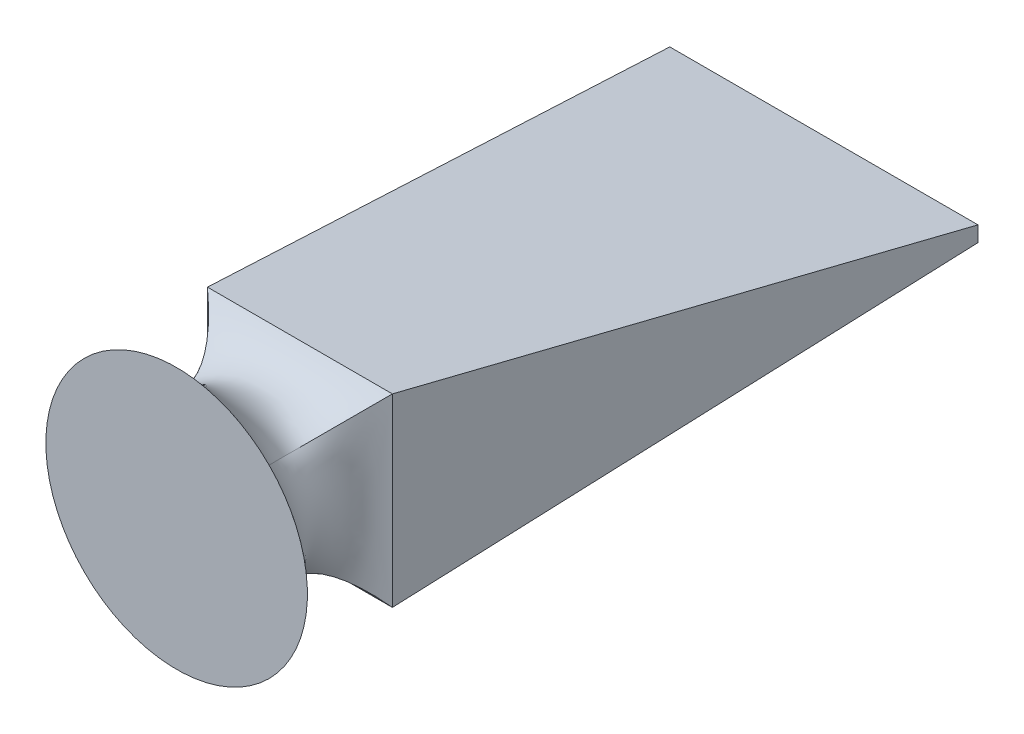
ISO-10303-21;
HEADER;
FILE_DESCRIPTION(('STEP AP214'),'2;1');
FILE_NAME('part.step','',(''),(''),'','','');
FILE_SCHEMA(('AUTOMOTIVE_DESIGN { 1 0 10303 214 1 1 1 1 }'));
ENDSEC;
DATA;
#1=APPLICATION_CONTEXT('core data for automotive mechanical design processes');
#2=APPLICATION_PROTOCOL_DEFINITION('international standard','automotive_design',2000,#1);
#3=PRODUCT_CONTEXT('',#1,'mechanical');
#4=PRODUCT('Part','Part','',(#3));
#5=PRODUCT_RELATED_PRODUCT_CATEGORY('part','',(#4));
#6=PRODUCT_DEFINITION_FORMATION('','',#4);
#7=PRODUCT_DEFINITION_CONTEXT('part definition',#1,'design');
#8=PRODUCT_DEFINITION('design','',#6,#7);
#9=PRODUCT_DEFINITION_SHAPE('','',#8);
#10=(LENGTH_UNIT() NAMED_UNIT(*) SI_UNIT(.MILLI.,.METRE.));
#11=(NAMED_UNIT(*) PLANE_ANGLE_UNIT() SI_UNIT($,.RADIAN.));
#12=(NAMED_UNIT(*) SI_UNIT($,.STERADIAN.) SOLID_ANGLE_UNIT());
#13=UNCERTAINTY_MEASURE_WITH_UNIT(LENGTH_MEASURE(1.E-05),#10,'distance_accuracy_value','');
#14=(GEOMETRIC_REPRESENTATION_CONTEXT(3) GLOBAL_UNCERTAINTY_ASSIGNED_CONTEXT((#13)) GLOBAL_UNIT_ASSIGNED_CONTEXT((#10,
#11,#12)) REPRESENTATION_CONTEXT('',''));
#15=CARTESIAN_POINT('',(0.,0.,0.));
#16=DIRECTION('',(0.,0.,1.));
#17=DIRECTION('',(1.,0.,0.));
#18=AXIS2_PLACEMENT_3D('',#15,#16,#17);
#19=CARTESIAN_POINT('',(0.,0.,40.));
#20=DIRECTION('',(0.,0.,1.));
#21=DIRECTION('',(1.,0.,0.));
#22=AXIS2_PLACEMENT_3D('',#19,#20,#21);
#23=PLANE('',#22);
#24=CARTESIAN_POINT('',(0.,0.,40.));
#25=DIRECTION('',(0.,0.,1.));
#26=DIRECTION('',(1.,0.,0.));
#27=AXIS2_PLACEMENT_3D('',#24,#25,#26);
#28=CIRCLE('',#27,42.4264068711928);
#29=CARTESIAN_POINT('',(30.,30.,40.));
#30=VERTEX_POINT('',#29);
#31=CARTESIAN_POINT('',(-30.,30.,40.));
#32=VERTEX_POINT('',#31);
#33=EDGE_CURVE('E12',#30,#32,#28,.T.);
#34=ORIENTED_EDGE('',*,*,#33,.T.);
#35=CARTESIAN_POINT('',(-30.,-30.,40.));
#36=VERTEX_POINT('',#35);
#37=EDGE_CURVE('E80',#32,#36,#28,.T.);
#38=ORIENTED_EDGE('',*,*,#37,.T.);
#39=CARTESIAN_POINT('',(30.,-30.,40.));
#40=VERTEX_POINT('',#39);
#41=EDGE_CURVE('E294',#36,#40,#28,.T.);
#42=ORIENTED_EDGE('',*,*,#41,.T.);
#43=EDGE_CURVE('E224',#40,#30,#28,.T.);
#44=ORIENTED_EDGE('',*,*,#43,.T.);
#45=EDGE_LOOP('',(#34,#38,#42,#44));
#46=FACE_BOUND('',#45,.T.);
#47=ADVANCED_FACE('F71',(#46),#23,.T.);
#48=CARTESIAN_POINT('',(-30.,30.,0.));
#49=CARTESIAN_POINT('',(-21.7851130197758,21.7851130197758,6.66666666666667));
#50=CARTESIAN_POINT('',(-13.5415316418051,13.5415316418051,21.5787874344422));
#51=CARTESIAN_POINT('',(-21.7851130197758,21.7851130197758,33.3333333333333));
#52=CARTESIAN_POINT('',(-30.,30.,40.));
#53=CARTESIAN_POINT('',(-30.,10.,0.));
#54=CARTESIAN_POINT('',(-21.7851130197758,7.26170433992526,6.66666666666667));
#55=CARTESIAN_POINT('',(-25.7665490029279,7.05561384642157,21.5787874344422));
#56=CARTESIAN_POINT('',(-38.3425633174688,10.7042540422323,33.3333333333333));
#57=CARTESIAN_POINT('',(-46.557450297693,13.442549702307,40.));
#58=CARTESIAN_POINT('',(-30.,-10.,0.));
#59=CARTESIAN_POINT('',(-21.7851130197758,-7.26170433992526,6.66666666666667));
#60=CARTESIAN_POINT('',(-25.7665490029279,-7.05561384642156,21.5787874344422));
#61=CARTESIAN_POINT('',(-38.3425633174688,-10.7042540422323,33.3333333333333));
#62=CARTESIAN_POINT('',(-46.557450297693,-13.442549702307,40.));
#63=CARTESIAN_POINT('',(-30.,-30.,0.));
#64=CARTESIAN_POINT('',(-21.7851130197758,-21.7851130197758,6.66666666666667));
#65=CARTESIAN_POINT('',(-13.5415316418051,-13.5415316418051,21.5787874344422));
#66=CARTESIAN_POINT('',(-21.7851130197758,-21.7851130197758,33.3333333333333));
#67=CARTESIAN_POINT('',(-30.,-30.,40.));
#68=B_SPLINE_SURFACE_WITH_KNOTS('',3,3,((#48,#49,#50,#51,#52),(#53,#54,#55,#56,#57),(#58,#59,
#60,#61,#62),(#63,#64,#65,#66,#67)),.UNSPECIFIED.,.F.,.F.,.F.,(4,4),(4,1,4),(0.,1.),(0.,
0.470500775667723,1.),.UNSPECIFIED.);
#69=DIRECTION('',(0.,-1.,0.));
#70=VECTOR('',#69,1.);
#71=CARTESIAN_POINT('',(-30.,-30.,0.));
#72=LINE('',#71,#70);
#73=CARTESIAN_POINT('',(-30.,30.,0.));
#74=VERTEX_POINT('',#73);
#75=CARTESIAN_POINT('',(-30.,-30.,0.));
#76=VERTEX_POINT('',#75);
#77=EDGE_CURVE('E336',#74,#76,#72,.T.);
#78=CARTESIAN_POINT('',(-30.,-30.,0.));
#79=CARTESIAN_POINT('',(-21.7851130197758,-21.7851130197758,6.66666666666667));
#80=CARTESIAN_POINT('',(-13.5415316418051,-13.5415316418051,21.5787874344422));
#81=CARTESIAN_POINT('',(-21.7851130197758,-21.7851130197758,33.3333333333333));
#82=CARTESIAN_POINT('',(-30.,-30.,40.));
#83=B_SPLINE_CURVE_WITH_KNOTS('',3,(#78,#79,#80,#81,#82),.UNSPECIFIED.,.F.,.F.,(4,1,4),(0.,
0.470500775667723,1.),.UNSPECIFIED.);
#84=EDGE_CURVE('E196',#76,#36,#83,.T.);
#85=CARTESIAN_POINT('',(-30.,30.,0.));
#86=CARTESIAN_POINT('',(-21.7851130197758,21.7851130197758,6.66666666666667));
#87=CARTESIAN_POINT('',(-13.5415316418051,13.5415316418051,21.5787874344422));
#88=CARTESIAN_POINT('',(-21.7851130197758,21.7851130197758,33.3333333333333));
#89=CARTESIAN_POINT('',(-30.,30.,40.));
#90=B_SPLINE_CURVE_WITH_KNOTS('',3,(#85,#86,#87,#88,#89),.UNSPECIFIED.,.F.,.F.,(4,1,4),(0.,
0.470500775667723,1.),.UNSPECIFIED.);
#91=EDGE_CURVE('E205',#32,#74,#90,.F.);
#92=ORIENTED_EDGE('',*,*,#77,.T.);
#93=ORIENTED_EDGE('',*,*,#84,.T.);
#94=ORIENTED_EDGE('',*,*,#37,.F.);
#95=ORIENTED_EDGE('',*,*,#91,.T.);
#96=EDGE_LOOP('',(#92,#93,#94,#95));
#97=FACE_BOUND('',#96,.T.);
#98=ADVANCED_FACE('F392',(#97),#68,.T.);
#99=CARTESIAN_POINT('',(-30.,-30.,0.));
#100=CARTESIAN_POINT('',(-21.7851130197758,-21.7851130197758,6.66666666666667));
#101=CARTESIAN_POINT('',(-13.5415316418051,-13.5415316418051,21.5787874344422));
#102=CARTESIAN_POINT('',(-21.7851130197758,-21.7851130197758,33.3333333333333));
#103=CARTESIAN_POINT('',(-30.,-30.,40.));
#104=CARTESIAN_POINT('',(-10.,-30.,0.));
#105=CARTESIAN_POINT('',(-7.26170433992526,-21.7851130197758,6.66666666666667));
#106=CARTESIAN_POINT('',(-7.05561384642157,-25.7665490029279,21.5787874344422));
#107=CARTESIAN_POINT('',(-10.7042540422323,-38.3425633174688,33.3333333333333));
#108=CARTESIAN_POINT('',(-13.442549702307,-46.557450297693,40.));
#109=CARTESIAN_POINT('',(10.,-30.,0.));
#110=CARTESIAN_POINT('',(7.26170433992527,-21.7851130197758,6.66666666666667));
#111=CARTESIAN_POINT('',(7.05561384642156,-25.7665490029279,21.5787874344422));
#112=CARTESIAN_POINT('',(10.7042540422323,-38.3425633174688,33.3333333333333));
#113=CARTESIAN_POINT('',(13.442549702307,-46.557450297693,40.));
#114=CARTESIAN_POINT('',(30.,-30.,0.));
#115=CARTESIAN_POINT('',(21.7851130197758,-21.7851130197758,6.66666666666667));
#116=CARTESIAN_POINT('',(13.5415316418051,-13.5415316418051,21.5787874344422));
#117=CARTESIAN_POINT('',(21.7851130197758,-21.7851130197758,33.3333333333333));
#118=CARTESIAN_POINT('',(30.,-30.,40.));
#119=B_SPLINE_SURFACE_WITH_KNOTS('',3,3,((#99,#100,#101,#102,#103),(#104,#105,#106,#107,#108),
(#109,#110,#111,#112,#113),(#114,#115,#116,#117,#118)),.UNSPECIFIED.,.F.,.F.,.F.,(4,4),(4,1,4),
(0.,1.),(0.,0.470500775667723,1.),.UNSPECIFIED.);
#120=DIRECTION('',(1.,0.,0.));
#121=VECTOR('',#120,1.);
#122=CARTESIAN_POINT('',(30.,-30.,0.));
#123=LINE('',#122,#121);
#124=CARTESIAN_POINT('',(30.,-30.,0.));
#125=VERTEX_POINT('',#124);
#126=EDGE_CURVE('E234',#76,#125,#123,.T.);
#127=CARTESIAN_POINT('',(30.,-30.,0.));
#128=CARTESIAN_POINT('',(21.7851130197758,-21.7851130197758,6.66666666666667));
#129=CARTESIAN_POINT('',(13.5415316418051,-13.5415316418051,21.5787874344422));
#130=CARTESIAN_POINT('',(21.7851130197758,-21.7851130197758,33.3333333333333));
#131=CARTESIAN_POINT('',(30.,-30.,40.));
#132=B_SPLINE_CURVE_WITH_KNOTS('',3,(#127,#128,#129,#130,#131),.UNSPECIFIED.,.F.,.F.,(4,1,4),
(0.,0.470500775667723,1.),.UNSPECIFIED.);
#133=EDGE_CURVE('E204',#125,#40,#132,.T.);
#134=ORIENTED_EDGE('',*,*,#126,.T.);
#135=ORIENTED_EDGE('',*,*,#133,.T.);
#136=ORIENTED_EDGE('',*,*,#41,.F.);
#137=ORIENTED_EDGE('',*,*,#84,.F.);
#138=EDGE_LOOP('',(#134,#135,#136,#137));
#139=FACE_BOUND('',#138,.T.);
#140=ADVANCED_FACE('F270',(#139),#119,.T.);
#141=CARTESIAN_POINT('',(30.,30.,0.));
#142=CARTESIAN_POINT('',(21.7851130197758,21.7851130197758,6.66666666666666));
#143=CARTESIAN_POINT('',(13.5415316418051,13.5415316418051,21.5787874344422));
#144=CARTESIAN_POINT('',(21.7851130197758,21.7851130197758,33.3333333333333));
#145=CARTESIAN_POINT('',(30.,30.,40.));
#146=CARTESIAN_POINT('',(10.,30.,0.));
#147=CARTESIAN_POINT('',(7.26170433992527,21.7851130197758,6.66666666666667));
#148=CARTESIAN_POINT('',(7.05561384642157,25.7665490029279,21.5787874344422));
#149=CARTESIAN_POINT('',(10.7042540422323,38.3425633174688,33.3333333333333));
#150=CARTESIAN_POINT('',(13.442549702307,46.557450297693,40.));
#151=CARTESIAN_POINT('',(-10.,30.,0.));
#152=CARTESIAN_POINT('',(-7.26170433992526,21.7851130197758,6.66666666666667));
#153=CARTESIAN_POINT('',(-7.05561384642156,25.7665490029279,21.5787874344422));
#154=CARTESIAN_POINT('',(-10.7042540422323,38.3425633174688,33.3333333333333));
#155=CARTESIAN_POINT('',(-13.442549702307,46.557450297693,40.));
#156=CARTESIAN_POINT('',(-30.,30.,0.));
#157=CARTESIAN_POINT('',(-21.7851130197758,21.7851130197758,6.66666666666667));
#158=CARTESIAN_POINT('',(-13.5415316418051,13.5415316418051,21.5787874344422));
#159=CARTESIAN_POINT('',(-21.7851130197758,21.7851130197758,33.3333333333333));
#160=CARTESIAN_POINT('',(-30.,30.,40.));
#161=B_SPLINE_SURFACE_WITH_KNOTS('',3,3,((#141,#142,#143,#144,#145),(#146,#147,#148,#149,#150),
(#151,#152,#153,#154,#155),(#156,#157,#158,#159,#160)),.UNSPECIFIED.,.F.,.F.,.F.,(4,4),(4,1,4),
(0.,1.),(0.,0.470500775667723,1.),.UNSPECIFIED.);
#162=DIRECTION('',(-1.,0.,0.));
#163=VECTOR('',#162,1.);
#164=CARTESIAN_POINT('',(30.,30.,0.));
#165=LINE('',#164,#163);
#166=CARTESIAN_POINT('',(30.,30.,0.));
#167=VERTEX_POINT('',#166);
#168=EDGE_CURVE('E328',#167,#74,#165,.T.);
#169=CARTESIAN_POINT('',(30.,30.,0.));
#170=CARTESIAN_POINT('',(21.7851130197758,21.7851130197758,6.66666666666666));
#171=CARTESIAN_POINT('',(13.5415316418051,13.5415316418051,21.5787874344422));
#172=CARTESIAN_POINT('',(21.7851130197758,21.7851130197758,33.3333333333333));
#173=CARTESIAN_POINT('',(30.,30.,40.));
#174=B_SPLINE_CURVE_WITH_KNOTS('',3,(#169,#170,#171,#172,#173),.UNSPECIFIED.,.F.,.F.,(4,1,4),
(0.,0.470500775667723,1.),.UNSPECIFIED.);
#175=EDGE_CURVE('E215',#167,#30,#174,.T.);
#176=ORIENTED_EDGE('',*,*,#168,.T.);
#177=ORIENTED_EDGE('',*,*,#91,.F.);
#178=ORIENTED_EDGE('',*,*,#33,.F.);
#179=ORIENTED_EDGE('',*,*,#175,.F.);
#180=EDGE_LOOP('',(#176,#177,#178,#179));
#181=FACE_BOUND('',#180,.T.);
#182=ADVANCED_FACE('F259',(#181),#161,.T.);
#183=CARTESIAN_POINT('',(30.,-30.,0.));
#184=CARTESIAN_POINT('',(21.7851130197758,-21.7851130197758,6.66666666666667));
#185=CARTESIAN_POINT('',(13.5415316418051,-13.5415316418051,21.5787874344422));
#186=CARTESIAN_POINT('',(21.7851130197758,-21.7851130197758,33.3333333333333));
#187=CARTESIAN_POINT('',(30.,-30.,40.));
#188=CARTESIAN_POINT('',(30.,-9.99999999999999,0.));
#189=CARTESIAN_POINT('',(21.7851130197758,-7.26170433992526,6.66666666666667));
#190=CARTESIAN_POINT('',(25.7665490029279,-7.05561384642157,21.5787874344422));
#191=CARTESIAN_POINT('',(38.3425633174688,-10.7042540422323,33.3333333333333));
#192=CARTESIAN_POINT('',(46.557450297693,-13.442549702307,40.));
#193=CARTESIAN_POINT('',(30.,10.,0.));
#194=CARTESIAN_POINT('',(21.7851130197758,7.26170433992527,6.66666666666666));
#195=CARTESIAN_POINT('',(25.7665490029279,7.05561384642156,21.5787874344422));
#196=CARTESIAN_POINT('',(38.3425633174688,10.7042540422322,33.3333333333333));
#197=CARTESIAN_POINT('',(46.557450297693,13.442549702307,40.));
#198=CARTESIAN_POINT('',(30.,30.,0.));
#199=CARTESIAN_POINT('',(21.7851130197758,21.7851130197758,6.66666666666666));
#200=CARTESIAN_POINT('',(13.5415316418051,13.5415316418051,21.5787874344422));
#201=CARTESIAN_POINT('',(21.7851130197758,21.7851130197758,33.3333333333333));
#202=CARTESIAN_POINT('',(30.,30.,40.));
#203=B_SPLINE_SURFACE_WITH_KNOTS('',3,3,((#183,#184,#185,#186,#187),(#188,#189,#190,#191,#192),
(#193,#194,#195,#196,#197),(#198,#199,#200,#201,#202)),.UNSPECIFIED.,.F.,.F.,.F.,(4,4),(4,1,4),
(0.,1.),(0.,0.470500775667723,1.),.UNSPECIFIED.);
#204=DIRECTION('',(0.,1.,0.));
#205=VECTOR('',#204,1.);
#206=CARTESIAN_POINT('',(30.,-30.,0.));
#207=LINE('',#206,#205);
#208=EDGE_CURVE('E132',#125,#167,#207,.T.);
#209=ORIENTED_EDGE('',*,*,#208,.T.);
#210=ORIENTED_EDGE('',*,*,#175,.T.);
#211=ORIENTED_EDGE('',*,*,#43,.F.);
#212=ORIENTED_EDGE('',*,*,#133,.F.);
#213=EDGE_LOOP('',(#209,#210,#211,#212));
#214=FACE_BOUND('',#213,.T.);
#215=ADVANCED_FACE('F170',(#214),#203,.T.);
#216=CARTESIAN_POINT('',(0.,0.,-170.));
#217=DIRECTION('',(0.,0.,1.));
#218=DIRECTION('',(1.,0.,0.));
#219=AXIS2_PLACEMENT_3D('',#216,#217,#218);
#220=PLANE('',#219);
#221=DIRECTION('',(0.,-1.,0.));
#222=VECTOR('',#221,1.);
#223=CARTESIAN_POINT('',(-50.,-2.50000000000001,-170.));
#224=LINE('',#223,#222);
#225=CARTESIAN_POINT('',(-50.,2.49999999999999,-170.));
#226=VERTEX_POINT('',#225);
#227=CARTESIAN_POINT('',(-50.,-2.50000000000001,-170.));
#228=VERTEX_POINT('',#227);
#229=EDGE_CURVE('E191',#226,#228,#224,.T.);
#230=ORIENTED_EDGE('',*,*,#229,.F.);
#231=DIRECTION('',(-1.,0.,0.));
#232=VECTOR('',#231,1.);
#233=CARTESIAN_POINT('',(50.,2.50000000000001,-170.));
#234=LINE('',#233,#232);
#235=CARTESIAN_POINT('',(50.,2.50000000000001,-170.));
#236=VERTEX_POINT('',#235);
#237=EDGE_CURVE('E151',#236,#226,#234,.T.);
#238=ORIENTED_EDGE('',*,*,#237,.F.);
#239=DIRECTION('',(0.,1.,0.));
#240=VECTOR('',#239,1.);
#241=CARTESIAN_POINT('',(50.,-2.49999999999999,-170.));
#242=LINE('',#241,#240);
#243=CARTESIAN_POINT('',(50.,-2.49999999999999,-170.));
#244=VERTEX_POINT('',#243);
#245=EDGE_CURVE('E128',#244,#236,#242,.T.);
#246=ORIENTED_EDGE('',*,*,#245,.F.);
#247=DIRECTION('',(1.,0.,0.));
#248=VECTOR('',#247,1.);
#249=CARTESIAN_POINT('',(50.,-2.49999999999999,-170.));
#250=LINE('',#249,#248);
#251=EDGE_CURVE('E137',#228,#244,#250,.T.);
#252=ORIENTED_EDGE('',*,*,#251,.F.);
#253=EDGE_LOOP('',(#230,#238,#246,#252));
#254=FACE_BOUND('',#253,.T.);
#255=ADVANCED_FACE('F150',(#254),#220,.F.);
#256=CARTESIAN_POINT('',(0.,-29.2349841938883,-4.72918861959958));
#257=DIRECTION('',(0.,0.98716739873722,0.159688843913374));
#258=DIRECTION('',(0.,-0.159688843913374,0.98716739873722));
#259=AXIS2_PLACEMENT_3D('',#256,#257,#258);
#260=PLANE('',#259);
#261=DIRECTION('',(-0.115361952656009,-0.158622684902012,0.980576597576074));
#262=VECTOR('',#261,1.);
#263=CARTESIAN_POINT('',(50.,-2.49999999999999,-170.));
#264=LINE('',#263,#262);
#265=EDGE_CURVE('E123',#244,#125,#264,.T.);
#266=ORIENTED_EDGE('',*,*,#265,.T.);
#267=ORIENTED_EDGE('',*,*,#126,.F.);
#268=DIRECTION('',(0.115361952656009,-0.158622684902012,0.980576597576074));
#269=VECTOR('',#268,1.);
#270=CARTESIAN_POINT('',(-50.,-2.50000000000001,-170.));
#271=LINE('',#270,#269);
#272=EDGE_CURVE('E136',#228,#76,#271,.T.);
#273=ORIENTED_EDGE('',*,*,#272,.F.);
#274=ORIENTED_EDGE('',*,*,#251,.T.);
#275=EDGE_LOOP('',(#266,#267,#273,#274));
#276=FACE_BOUND('',#275,.T.);
#277=ADVANCED_FACE('F141',(#276),#260,.F.);
#278=CARTESIAN_POINT('',(-29.5904436860068,0.,3.48122866894198));
#279=DIRECTION('',(0.993150604322876,0.,-0.116841247567397));
#280=DIRECTION('',(-0.116841247567397,0.,-0.993150604322876));
#281=AXIS2_PLACEMENT_3D('',#278,#279,#280);
#282=PLANE('',#281);
#283=ORIENTED_EDGE('',*,*,#272,.T.);
#284=ORIENTED_EDGE('',*,*,#77,.F.);
#285=DIRECTION('',(0.115361952656009,0.158622684902012,0.980576597576074));
#286=VECTOR('',#285,1.);
#287=CARTESIAN_POINT('',(-50.,2.49999999999999,-170.));
#288=LINE('',#287,#286);
#289=EDGE_CURVE('E346',#226,#74,#288,.T.);
#290=ORIENTED_EDGE('',*,*,#289,.F.);
#291=ORIENTED_EDGE('',*,*,#229,.T.);
#292=EDGE_LOOP('',(#283,#284,#290,#291));
#293=FACE_BOUND('',#292,.T.);
#294=ADVANCED_FACE('F367',(#293),#282,.F.);
#295=CARTESIAN_POINT('',(29.5904436860068,0.,3.48122866894198));
#296=DIRECTION('',(-0.993150604322876,0.,-0.116841247567397));
#297=DIRECTION('',(-0.116841247567397,0.,0.993150604322876));
#298=AXIS2_PLACEMENT_3D('',#295,#296,#297);
#299=PLANE('',#298);
#300=DIRECTION('',(-0.115361952656009,0.158622684902012,0.980576597576074));
#301=VECTOR('',#300,1.);
#302=CARTESIAN_POINT('',(50.,2.50000000000001,-170.));
#303=LINE('',#302,#301);
#304=EDGE_CURVE('E349',#236,#167,#303,.T.);
#305=ORIENTED_EDGE('',*,*,#304,.T.);
#306=ORIENTED_EDGE('',*,*,#208,.F.);
#307=ORIENTED_EDGE('',*,*,#265,.F.);
#308=ORIENTED_EDGE('',*,*,#245,.T.);
#309=EDGE_LOOP('',(#305,#306,#307,#308));
#310=FACE_BOUND('',#309,.T.);
#311=ADVANCED_FACE('F126',(#310),#299,.F.);
#312=CARTESIAN_POINT('',(0.,29.2349841938883,-4.72918861959958));
#313=DIRECTION('',(0.,-0.98716739873722,0.159688843913374));
#314=DIRECTION('',(0.,-0.159688843913374,-0.98716739873722));
#315=AXIS2_PLACEMENT_3D('',#312,#313,#314);
#316=PLANE('',#315);
#317=ORIENTED_EDGE('',*,*,#289,.T.);
#318=ORIENTED_EDGE('',*,*,#168,.F.);
#319=ORIENTED_EDGE('',*,*,#304,.F.);
#320=ORIENTED_EDGE('',*,*,#237,.T.);
#321=EDGE_LOOP('',(#317,#318,#319,#320));
#322=FACE_BOUND('',#321,.T.);
#323=ADVANCED_FACE('F378',(#322),#316,.F.);
#324=CLOSED_SHELL('',(#47,#98,#140,#182,#215,#255,#277,#294,#311,#323));
#325=MANIFOLD_SOLID_BREP('B2',#324);
#326=ADVANCED_BREP_SHAPE_REPRESENTATION('',(#18,#325),#14);
#327=SHAPE_DEFINITION_REPRESENTATION(#9,#326);
ENDSEC;
END-ISO-10303-21;
